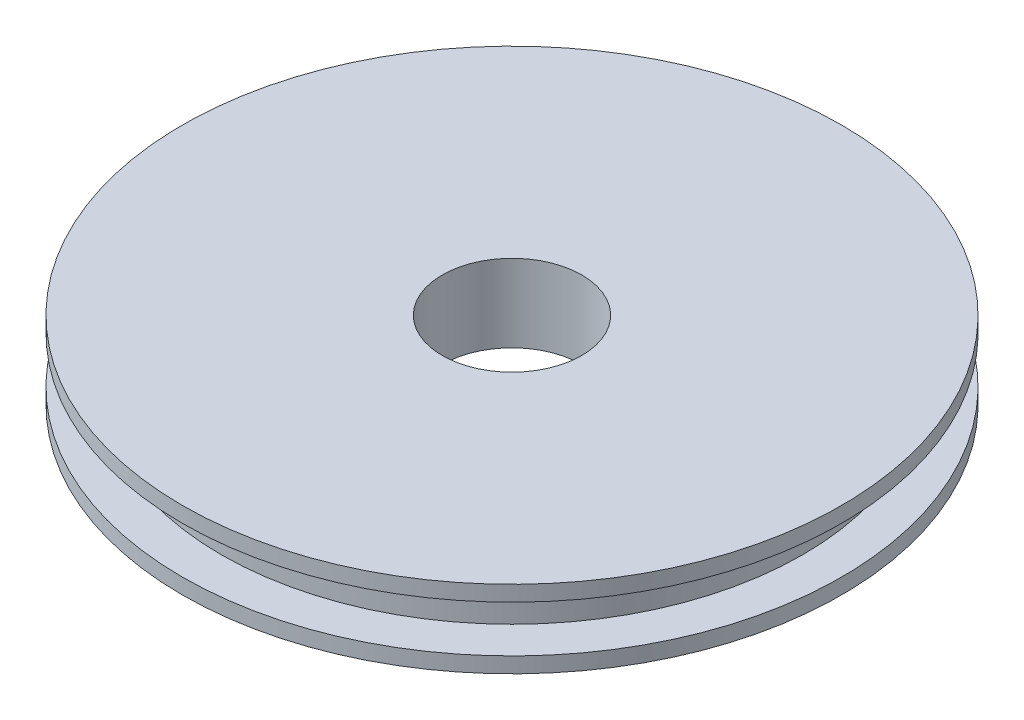
ISO-10303-21;
HEADER;
FILE_DESCRIPTION(('STEP AP214'),'2;1');
FILE_NAME('part.step','',(''),(''),'','','');
FILE_SCHEMA(('AUTOMOTIVE_DESIGN { 1 0 10303 214 1 1 1 1 }'));
ENDSEC;
DATA;
#1=APPLICATION_CONTEXT('core data for automotive mechanical design processes');
#2=APPLICATION_PROTOCOL_DEFINITION('international standard','automotive_design',2000,#1);
#3=PRODUCT_CONTEXT('',#1,'mechanical');
#4=PRODUCT('Part','Part','',(#3));
#5=PRODUCT_RELATED_PRODUCT_CATEGORY('part','',(#4));
#6=PRODUCT_DEFINITION_FORMATION('','',#4);
#7=PRODUCT_DEFINITION_CONTEXT('part definition',#1,'design');
#8=PRODUCT_DEFINITION('design','',#6,#7);
#9=PRODUCT_DEFINITION_SHAPE('','',#8);
#10=(LENGTH_UNIT() NAMED_UNIT(*) SI_UNIT(.MILLI.,.METRE.));
#11=(NAMED_UNIT(*) PLANE_ANGLE_UNIT() SI_UNIT($,.RADIAN.));
#12=(NAMED_UNIT(*) SI_UNIT($,.STERADIAN.) SOLID_ANGLE_UNIT());
#13=UNCERTAINTY_MEASURE_WITH_UNIT(LENGTH_MEASURE(1.E-05),#10,'distance_accuracy_value','');
#14=(GEOMETRIC_REPRESENTATION_CONTEXT(3) GLOBAL_UNCERTAINTY_ASSIGNED_CONTEXT((#13)) GLOBAL_UNIT_ASSIGNED_CONTEXT((#10,
#11,#12)) REPRESENTATION_CONTEXT('',''));
#15=CARTESIAN_POINT('',(0.,0.,0.));
#16=DIRECTION('',(0.,0.,1.));
#17=DIRECTION('',(1.,0.,0.));
#18=AXIS2_PLACEMENT_3D('',#15,#16,#17);
#19=CARTESIAN_POINT('',(0.,0.,0.));
#20=DIRECTION('',(0.,-1.,0.));
#21=DIRECTION('',(0.,0.,-1.));
#22=AXIS2_PLACEMENT_3D('',#19,#20,#21);
#23=CYLINDRICAL_SURFACE('',#22,9.);
#24=CARTESIAN_POINT('',(0.,0.,0.));
#25=DIRECTION('',(0.,-1.,0.));
#26=DIRECTION('',(0.,0.,-1.));
#27=AXIS2_PLACEMENT_3D('',#24,#25,#26);
#28=CIRCLE('',#27,9.);
#29=CARTESIAN_POINT('',(0.,0.,-9.));
#30=VERTEX_POINT('',#29);
#31=EDGE_CURVE('E58',#30,#30,#28,.T.);
#32=ORIENTED_EDGE('',*,*,#31,.T.);
#33=EDGE_LOOP('',(#32));
#34=FACE_BOUND('',#33,.T.);
#35=CARTESIAN_POINT('',(0.,10.,0.));
#36=DIRECTION('',(0.,-1.,0.));
#37=DIRECTION('',(0.,0.,-1.));
#38=AXIS2_PLACEMENT_3D('',#35,#36,#37);
#39=CIRCLE('',#38,9.);
#40=CARTESIAN_POINT('',(0.,10.,-9.));
#41=VERTEX_POINT('',#40);
#42=EDGE_CURVE('E10',#41,#41,#39,.T.);
#43=ORIENTED_EDGE('',*,*,#42,.F.);
#44=EDGE_LOOP('',(#43));
#45=FACE_BOUND('',#44,.T.);
#46=ADVANCED_FACE('F30',(#34,#45),#23,.F.);
#47=CARTESIAN_POINT('',(9.,10.,0.));
#48=DIRECTION('',(0.,1.,0.));
#49=DIRECTION('',(0.,0.,1.));
#50=AXIS2_PLACEMENT_3D('',#47,#48,#49);
#51=PLANE('',#50);
#52=ORIENTED_EDGE('',*,*,#42,.T.);
#53=EDGE_LOOP('',(#52));
#54=FACE_BOUND('',#53,.T.);
#55=CARTESIAN_POINT('',(0.,10.,0.));
#56=DIRECTION('',(0.,-1.,0.));
#57=DIRECTION('',(0.,0.,-1.));
#58=AXIS2_PLACEMENT_3D('',#55,#56,#57);
#59=CIRCLE('',#58,42.5);
#60=CARTESIAN_POINT('',(0.,10.,-42.5));
#61=VERTEX_POINT('',#60);
#62=EDGE_CURVE('E36',#61,#61,#59,.T.);
#63=ORIENTED_EDGE('',*,*,#62,.F.);
#64=EDGE_LOOP('',(#63));
#65=FACE_BOUND('',#64,.T.);
#66=ADVANCED_FACE('F76',(#54,#65),#51,.T.);
#67=CARTESIAN_POINT('',(0.,0.,0.));
#68=DIRECTION('',(0.,-1.,0.));
#69=DIRECTION('',(0.,0.,-1.));
#70=AXIS2_PLACEMENT_3D('',#67,#68,#69);
#71=CYLINDRICAL_SURFACE('',#70,42.5);
#72=ORIENTED_EDGE('',*,*,#62,.T.);
#73=EDGE_LOOP('',(#72));
#74=FACE_BOUND('',#73,.T.);
#75=CARTESIAN_POINT('',(0.,8.,0.));
#76=DIRECTION('',(0.,-1.,0.));
#77=DIRECTION('',(0.,0.,-1.));
#78=AXIS2_PLACEMENT_3D('',#75,#76,#77);
#79=CIRCLE('',#78,42.5);
#80=CARTESIAN_POINT('',(0.,8.,-42.5));
#81=VERTEX_POINT('',#80);
#82=EDGE_CURVE('E40',#81,#81,#79,.T.);
#83=ORIENTED_EDGE('',*,*,#82,.F.);
#84=EDGE_LOOP('',(#83));
#85=FACE_BOUND('',#84,.T.);
#86=ADVANCED_FACE('F80',(#74,#85),#71,.T.);
#87=CARTESIAN_POINT('',(42.5,8.,0.));
#88=DIRECTION('',(0.,-1.,0.));
#89=DIRECTION('',(0.,0.,-1.));
#90=AXIS2_PLACEMENT_3D('',#87,#88,#89);
#91=PLANE('',#90);
#92=ORIENTED_EDGE('',*,*,#82,.T.);
#93=EDGE_LOOP('',(#92));
#94=FACE_BOUND('',#93,.T.);
#95=CARTESIAN_POINT('',(0.,8.,0.));
#96=DIRECTION('',(0.,-1.,0.));
#97=DIRECTION('',(0.,0.,-1.));
#98=AXIS2_PLACEMENT_3D('',#95,#96,#97);
#99=CIRCLE('',#98,37.5);
#100=CARTESIAN_POINT('',(0.,8.,-37.5));
#101=VERTEX_POINT('',#100);
#102=EDGE_CURVE('E44',#101,#101,#99,.T.);
#103=ORIENTED_EDGE('',*,*,#102,.F.);
#104=EDGE_LOOP('',(#103));
#105=FACE_BOUND('',#104,.T.);
#106=ADVANCED_FACE('F84',(#94,#105),#91,.T.);
#107=CARTESIAN_POINT('',(0.,0.,0.));
#108=DIRECTION('',(0.,-1.,0.));
#109=DIRECTION('',(0.,0.,-1.));
#110=AXIS2_PLACEMENT_3D('',#107,#108,#109);
#111=CYLINDRICAL_SURFACE('',#110,37.5);
#112=ORIENTED_EDGE('',*,*,#102,.T.);
#113=EDGE_LOOP('',(#112));
#114=FACE_BOUND('',#113,.T.);
#115=CARTESIAN_POINT('',(0.,2.,0.));
#116=DIRECTION('',(0.,-1.,0.));
#117=DIRECTION('',(0.,0.,-1.));
#118=AXIS2_PLACEMENT_3D('',#115,#116,#117);
#119=CIRCLE('',#118,37.5);
#120=CARTESIAN_POINT('',(0.,2.,-37.5));
#121=VERTEX_POINT('',#120);
#122=EDGE_CURVE('E49',#121,#121,#119,.T.);
#123=ORIENTED_EDGE('',*,*,#122,.F.);
#124=EDGE_LOOP('',(#123));
#125=FACE_BOUND('',#124,.T.);
#126=ADVANCED_FACE('F90',(#114,#125),#111,.T.);
#127=CARTESIAN_POINT('',(37.5,2.,0.));
#128=DIRECTION('',(0.,1.,0.));
#129=DIRECTION('',(0.,0.,1.));
#130=AXIS2_PLACEMENT_3D('',#127,#128,#129);
#131=PLANE('',#130);
#132=ORIENTED_EDGE('',*,*,#122,.T.);
#133=EDGE_LOOP('',(#132));
#134=FACE_BOUND('',#133,.T.);
#135=CARTESIAN_POINT('',(0.,2.,0.));
#136=DIRECTION('',(0.,-1.,0.));
#137=DIRECTION('',(0.,0.,-1.));
#138=AXIS2_PLACEMENT_3D('',#135,#136,#137);
#139=CIRCLE('',#138,42.5);
#140=CARTESIAN_POINT('',(0.,2.,-42.5));
#141=VERTEX_POINT('',#140);
#142=EDGE_CURVE('E52',#141,#141,#139,.T.);
#143=ORIENTED_EDGE('',*,*,#142,.F.);
#144=EDGE_LOOP('',(#143));
#145=FACE_BOUND('',#144,.T.);
#146=ADVANCED_FACE('F72',(#134,#145),#131,.T.);
#147=CARTESIAN_POINT('',(0.,0.,0.));
#148=DIRECTION('',(0.,-1.,0.));
#149=DIRECTION('',(0.,0.,-1.));
#150=AXIS2_PLACEMENT_3D('',#147,#148,#149);
#151=CYLINDRICAL_SURFACE('',#150,42.5);
#152=ORIENTED_EDGE('',*,*,#142,.T.);
#153=EDGE_LOOP('',(#152));
#154=FACE_BOUND('',#153,.T.);
#155=CARTESIAN_POINT('',(0.,0.,0.));
#156=DIRECTION('',(0.,-1.,0.));
#157=DIRECTION('',(0.,0.,-1.));
#158=AXIS2_PLACEMENT_3D('',#155,#156,#157);
#159=CIRCLE('',#158,42.5);
#160=CARTESIAN_POINT('',(0.,0.,-42.5));
#161=VERTEX_POINT('',#160);
#162=EDGE_CURVE('E55',#161,#161,#159,.T.);
#163=ORIENTED_EDGE('',*,*,#162,.F.);
#164=EDGE_LOOP('',(#163));
#165=FACE_BOUND('',#164,.T.);
#166=ADVANCED_FACE('F66',(#154,#165),#151,.T.);
#167=CARTESIAN_POINT('',(42.5,0.,0.));
#168=DIRECTION('',(0.,-1.,0.));
#169=DIRECTION('',(0.,0.,-1.));
#170=AXIS2_PLACEMENT_3D('',#167,#168,#169);
#171=PLANE('',#170);
#172=ORIENTED_EDGE('',*,*,#162,.T.);
#173=EDGE_LOOP('',(#172));
#174=FACE_BOUND('',#173,.T.);
#175=ORIENTED_EDGE('',*,*,#31,.F.);
#176=EDGE_LOOP('',(#175));
#177=FACE_BOUND('',#176,.T.);
#178=ADVANCED_FACE('F64',(#174,#177),#171,.T.);
#179=CLOSED_SHELL('',(#46,#66,#86,#106,#126,#146,#166,#178));
#180=MANIFOLD_SOLID_BREP('B2',#179);
#181=ADVANCED_BREP_SHAPE_REPRESENTATION('',(#18,#180),#14);
#182=SHAPE_DEFINITION_REPRESENTATION(#9,#181);
ENDSEC;
END-ISO-10303-21;
